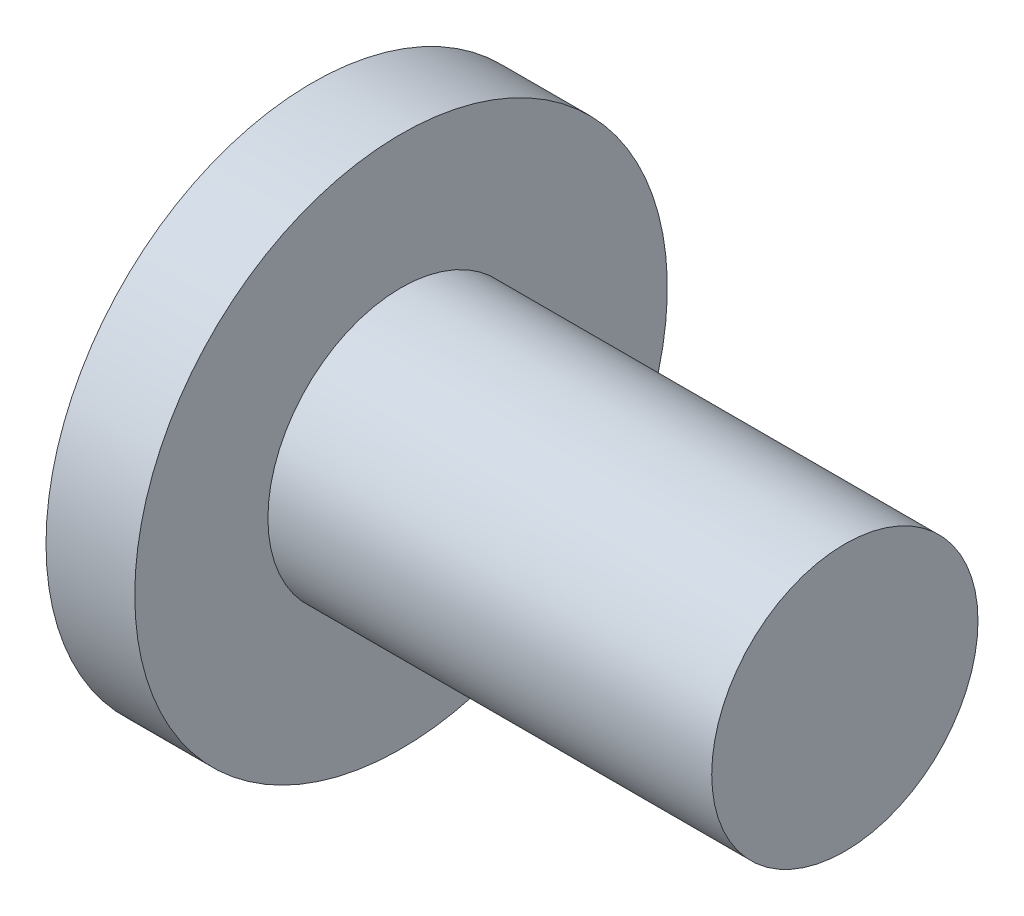
ISO-10303-21;
HEADER;
FILE_DESCRIPTION(('STEP AP214'),'2;1');
FILE_NAME('part.step','',(''),(''),'','','');
FILE_SCHEMA(('AUTOMOTIVE_DESIGN { 1 0 10303 214 1 1 1 1 }'));
ENDSEC;
DATA;
#1=APPLICATION_CONTEXT('core data for automotive mechanical design processes');
#2=APPLICATION_PROTOCOL_DEFINITION('international standard','automotive_design',2000,#1);
#3=PRODUCT_CONTEXT('',#1,'mechanical');
#4=PRODUCT('Part','Part','',(#3));
#5=PRODUCT_RELATED_PRODUCT_CATEGORY('part','',(#4));
#6=PRODUCT_DEFINITION_FORMATION('','',#4);
#7=PRODUCT_DEFINITION_CONTEXT('part definition',#1,'design');
#8=PRODUCT_DEFINITION('design','',#6,#7);
#9=PRODUCT_DEFINITION_SHAPE('','',#8);
#10=(LENGTH_UNIT() NAMED_UNIT(*) SI_UNIT(.MILLI.,.METRE.));
#11=(NAMED_UNIT(*) PLANE_ANGLE_UNIT() SI_UNIT($,.RADIAN.));
#12=(NAMED_UNIT(*) SI_UNIT($,.STERADIAN.) SOLID_ANGLE_UNIT());
#13=UNCERTAINTY_MEASURE_WITH_UNIT(LENGTH_MEASURE(1.E-05),#10,'distance_accuracy_value','');
#14=(GEOMETRIC_REPRESENTATION_CONTEXT(3) GLOBAL_UNCERTAINTY_ASSIGNED_CONTEXT((#13)) GLOBAL_UNIT_ASSIGNED_CONTEXT((#10,
#11,#12)) REPRESENTATION_CONTEXT('',''));
#15=CARTESIAN_POINT('',(0.,0.,0.));
#16=DIRECTION('',(0.,0.,1.));
#17=DIRECTION('',(1.,0.,0.));
#18=AXIS2_PLACEMENT_3D('',#15,#16,#17);
#19=CARTESIAN_POINT('',(0.,0.,0.));
#20=DIRECTION('',(-1.,0.,0.));
#21=DIRECTION('',(0.,0.,1.));
#22=AXIS2_PLACEMENT_3D('',#19,#20,#21);
#23=CYLINDRICAL_SURFACE('',#22,6.);
#24=CARTESIAN_POINT('',(0.,0.,0.));
#25=DIRECTION('',(-1.,0.,0.));
#26=DIRECTION('',(0.,0.,1.));
#27=AXIS2_PLACEMENT_3D('',#24,#25,#26);
#28=CIRCLE('',#27,6.);
#29=CARTESIAN_POINT('',(0.,0.,6.));
#30=VERTEX_POINT('',#29);
#31=EDGE_CURVE('E10',#30,#30,#28,.T.);
#32=ORIENTED_EDGE('',*,*,#31,.F.);
#33=EDGE_LOOP('',(#32));
#34=FACE_BOUND('',#33,.T.);
#35=CARTESIAN_POINT('',(2.,0.,0.));
#36=DIRECTION('',(-1.,0.,0.));
#37=DIRECTION('',(0.,0.,1.));
#38=AXIS2_PLACEMENT_3D('',#35,#36,#37);
#39=CIRCLE('',#38,6.);
#40=CARTESIAN_POINT('',(2.,0.,6.));
#41=VERTEX_POINT('',#40);
#42=EDGE_CURVE('E51',#41,#41,#39,.T.);
#43=ORIENTED_EDGE('',*,*,#42,.T.);
#44=EDGE_LOOP('',(#43));
#45=FACE_BOUND('',#44,.T.);
#46=ADVANCED_FACE('F37',(#34,#45),#23,.T.);
#47=CARTESIAN_POINT('',(0.,0.,-6.));
#48=DIRECTION('',(1.,0.,0.));
#49=DIRECTION('',(0.,0.,-1.));
#50=AXIS2_PLACEMENT_3D('',#47,#48,#49);
#51=PLANE('',#50);
#52=ORIENTED_EDGE('',*,*,#31,.T.);
#53=EDGE_LOOP('',(#52));
#54=FACE_BOUND('',#53,.T.);
#55=ADVANCED_FACE('F71',(#54),#51,.F.);
#56=CARTESIAN_POINT('',(12.,0.,0.));
#57=DIRECTION('',(-1.,0.,0.));
#58=DIRECTION('',(0.,0.,1.));
#59=AXIS2_PLACEMENT_3D('',#56,#57,#58);
#60=PLANE('',#59);
#61=CARTESIAN_POINT('',(12.,0.,0.));
#62=DIRECTION('',(-1.,0.,0.));
#63=DIRECTION('',(0.,0.,1.));
#64=AXIS2_PLACEMENT_3D('',#61,#62,#63);
#65=CIRCLE('',#64,3.);
#66=CARTESIAN_POINT('',(12.,0.,3.));
#67=VERTEX_POINT('',#66);
#68=EDGE_CURVE('E43',#67,#67,#65,.T.);
#69=ORIENTED_EDGE('',*,*,#68,.F.);
#70=EDGE_LOOP('',(#69));
#71=FACE_BOUND('',#70,.T.);
#72=ADVANCED_FACE('F66',(#71),#60,.F.);
#73=CARTESIAN_POINT('',(0.,0.,0.));
#74=DIRECTION('',(-1.,0.,0.));
#75=DIRECTION('',(0.,0.,1.));
#76=AXIS2_PLACEMENT_3D('',#73,#74,#75);
#77=CYLINDRICAL_SURFACE('',#76,3.);
#78=CARTESIAN_POINT('',(2.,0.,0.));
#79=DIRECTION('',(-1.,0.,0.));
#80=DIRECTION('',(0.,0.,1.));
#81=AXIS2_PLACEMENT_3D('',#78,#79,#80);
#82=CIRCLE('',#81,3.);
#83=CARTESIAN_POINT('',(2.,0.,3.));
#84=VERTEX_POINT('',#83);
#85=EDGE_CURVE('E47',#84,#84,#82,.T.);
#86=ORIENTED_EDGE('',*,*,#85,.F.);
#87=EDGE_LOOP('',(#86));
#88=FACE_BOUND('',#87,.T.);
#89=ORIENTED_EDGE('',*,*,#68,.T.);
#90=EDGE_LOOP('',(#89));
#91=FACE_BOUND('',#90,.T.);
#92=ADVANCED_FACE('F61',(#88,#91),#77,.T.);
#93=CARTESIAN_POINT('',(2.,0.,-3.));
#94=DIRECTION('',(-1.,0.,0.));
#95=DIRECTION('',(0.,0.,1.));
#96=AXIS2_PLACEMENT_3D('',#93,#94,#95);
#97=PLANE('',#96);
#98=ORIENTED_EDGE('',*,*,#42,.F.);
#99=EDGE_LOOP('',(#98));
#100=FACE_BOUND('',#99,.T.);
#101=ORIENTED_EDGE('',*,*,#85,.T.);
#102=EDGE_LOOP('',(#101));
#103=FACE_BOUND('',#102,.T.);
#104=ADVANCED_FACE('F58',(#100,#103),#97,.F.);
#105=CLOSED_SHELL('',(#46,#55,#72,#92,#104));
#106=MANIFOLD_SOLID_BREP('B2',#105);
#107=ADVANCED_BREP_SHAPE_REPRESENTATION('',(#18,#106),#14);
#108=SHAPE_DEFINITION_REPRESENTATION(#9,#107);
ENDSEC;
END-ISO-10303-21;
